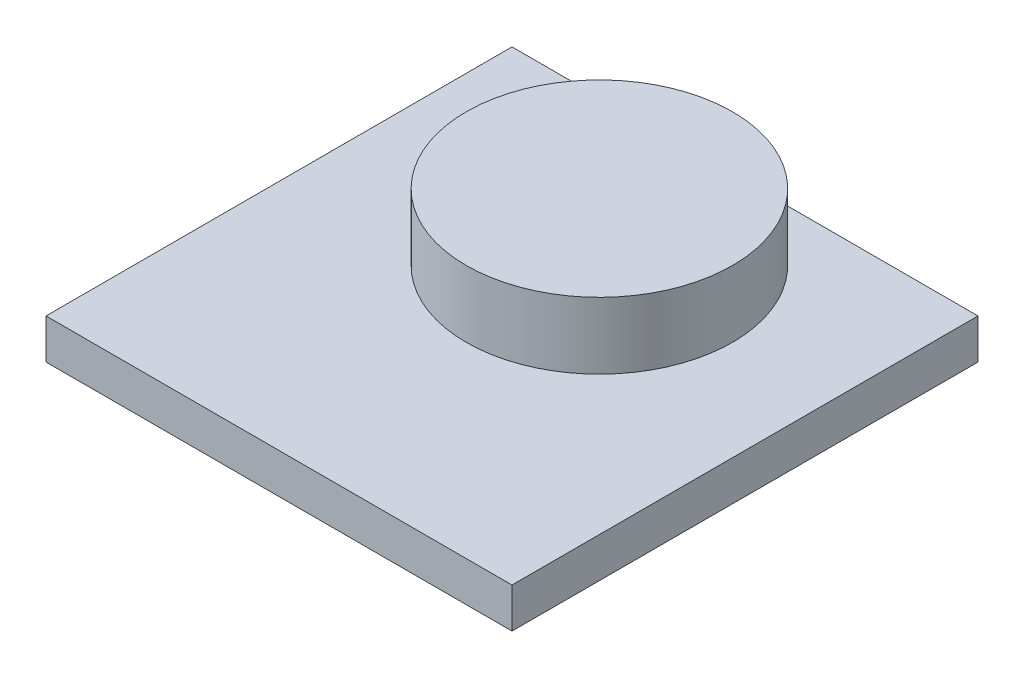
ISO-10303-21;
HEADER;
FILE_DESCRIPTION(('STEP AP214'),'2;1');
FILE_NAME('part.step','',(''),(''),'','','');
FILE_SCHEMA(('AUTOMOTIVE_DESIGN { 1 0 10303 214 1 1 1 1 }'));
ENDSEC;
DATA;
#1=APPLICATION_CONTEXT('core data for automotive mechanical design processes');
#2=APPLICATION_PROTOCOL_DEFINITION('international standard','automotive_design',2000,#1);
#3=PRODUCT_CONTEXT('',#1,'mechanical');
#4=PRODUCT('Part','Part','',(#3));
#5=PRODUCT_RELATED_PRODUCT_CATEGORY('part','',(#4));
#6=PRODUCT_DEFINITION_FORMATION('','',#4);
#7=PRODUCT_DEFINITION_CONTEXT('part definition',#1,'design');
#8=PRODUCT_DEFINITION('design','',#6,#7);
#9=PRODUCT_DEFINITION_SHAPE('','',#8);
#10=(LENGTH_UNIT() NAMED_UNIT(*) SI_UNIT(.MILLI.,.METRE.));
#11=(NAMED_UNIT(*) PLANE_ANGLE_UNIT() SI_UNIT($,.RADIAN.));
#12=(NAMED_UNIT(*) SI_UNIT($,.STERADIAN.) SOLID_ANGLE_UNIT());
#13=UNCERTAINTY_MEASURE_WITH_UNIT(LENGTH_MEASURE(1.E-05),#10,'distance_accuracy_value','');
#14=(GEOMETRIC_REPRESENTATION_CONTEXT(3) GLOBAL_UNCERTAINTY_ASSIGNED_CONTEXT((#13)) GLOBAL_UNIT_ASSIGNED_CONTEXT((#10,
#11,#12)) REPRESENTATION_CONTEXT('',''));
#15=CARTESIAN_POINT('',(0.,0.,0.));
#16=DIRECTION('',(0.,0.,1.));
#17=DIRECTION('',(1.,0.,0.));
#18=AXIS2_PLACEMENT_3D('',#15,#16,#17);
#19=CARTESIAN_POINT('',(0.,-3.,35.));
#20=DIRECTION('',(0.,0.,1.));
#21=DIRECTION('',(1.,0.,0.));
#22=AXIS2_PLACEMENT_3D('',#19,#20,#21);
#23=PLANE('',#22);
#24=DIRECTION('',(1.,0.,0.));
#25=VECTOR('',#24,1.);
#26=CARTESIAN_POINT('',(0.,0.,35.));
#27=LINE('',#26,#25);
#28=CARTESIAN_POINT('',(0.,0.,35.));
#29=VERTEX_POINT('',#28);
#30=CARTESIAN_POINT('',(35.,0.,35.));
#31=VERTEX_POINT('',#30);
#32=EDGE_CURVE('E113',#29,#31,#27,.T.);
#33=ORIENTED_EDGE('',*,*,#32,.F.);
#34=DIRECTION('',(0.,1.,0.));
#35=VECTOR('',#34,1.);
#36=CARTESIAN_POINT('',(0.,-3.,35.));
#37=LINE('',#36,#35);
#38=CARTESIAN_POINT('',(0.,-3.,35.));
#39=VERTEX_POINT('',#38);
#40=EDGE_CURVE('E51',#39,#29,#37,.T.);
#41=ORIENTED_EDGE('',*,*,#40,.F.);
#42=DIRECTION('',(1.,0.,0.));
#43=VECTOR('',#42,1.);
#44=CARTESIAN_POINT('',(0.,-3.,35.));
#45=LINE('',#44,#43);
#46=CARTESIAN_POINT('',(35.,-3.,35.));
#47=VERTEX_POINT('',#46);
#48=EDGE_CURVE('E105',#39,#47,#45,.T.);
#49=ORIENTED_EDGE('',*,*,#48,.T.);
#50=DIRECTION('',(0.,1.,0.));
#51=VECTOR('',#50,1.);
#52=CARTESIAN_POINT('',(35.,-3.,35.));
#53=LINE('',#52,#51);
#54=EDGE_CURVE('E44',#47,#31,#53,.T.);
#55=ORIENTED_EDGE('',*,*,#54,.T.);
#56=EDGE_LOOP('',(#33,#41,#49,#55));
#57=FACE_BOUND('',#56,.T.);
#58=ADVANCED_FACE('F41',(#57),#23,.T.);
#59=CARTESIAN_POINT('',(0.,-3.,0.));
#60=DIRECTION('',(-1.,0.,0.));
#61=DIRECTION('',(0.,0.,1.));
#62=AXIS2_PLACEMENT_3D('',#59,#60,#61);
#63=PLANE('',#62);
#64=DIRECTION('',(0.,0.,1.));
#65=VECTOR('',#64,1.);
#66=CARTESIAN_POINT('',(0.,0.,0.));
#67=LINE('',#66,#65);
#68=CARTESIAN_POINT('',(0.,0.,0.));
#69=VERTEX_POINT('',#68);
#70=EDGE_CURVE('E108',#69,#29,#67,.T.);
#71=ORIENTED_EDGE('',*,*,#70,.F.);
#72=DIRECTION('',(0.,1.,0.));
#73=VECTOR('',#72,1.);
#74=CARTESIAN_POINT('',(0.,-3.,0.));
#75=LINE('',#74,#73);
#76=CARTESIAN_POINT('',(0.,-3.,0.));
#77=VERTEX_POINT('',#76);
#78=EDGE_CURVE('E75',#77,#69,#75,.T.);
#79=ORIENTED_EDGE('',*,*,#78,.F.);
#80=DIRECTION('',(0.,0.,1.));
#81=VECTOR('',#80,1.);
#82=CARTESIAN_POINT('',(0.,-3.,0.));
#83=LINE('',#82,#81);
#84=EDGE_CURVE('E92',#77,#39,#83,.T.);
#85=ORIENTED_EDGE('',*,*,#84,.T.);
#86=ORIENTED_EDGE('',*,*,#40,.T.);
#87=EDGE_LOOP('',(#71,#79,#85,#86));
#88=FACE_BOUND('',#87,.T.);
#89=ADVANCED_FACE('F132',(#88),#63,.T.);
#90=CARTESIAN_POINT('',(0.,-3.,0.));
#91=DIRECTION('',(0.,0.,1.));
#92=DIRECTION('',(1.,0.,0.));
#93=AXIS2_PLACEMENT_3D('',#90,#91,#92);
#94=PLANE('',#93);
#95=DIRECTION('',(1.,0.,0.));
#96=VECTOR('',#95,1.);
#97=CARTESIAN_POINT('',(0.,0.,0.));
#98=LINE('',#97,#96);
#99=CARTESIAN_POINT('',(35.,0.,0.));
#100=VERTEX_POINT('',#99);
#101=EDGE_CURVE('E98',#69,#100,#98,.T.);
#102=ORIENTED_EDGE('',*,*,#101,.T.);
#103=DIRECTION('',(0.,1.,0.));
#104=VECTOR('',#103,1.);
#105=CARTESIAN_POINT('',(35.,-3.,0.));
#106=LINE('',#105,#104);
#107=CARTESIAN_POINT('',(35.,-3.,0.));
#108=VERTEX_POINT('',#107);
#109=EDGE_CURVE('E96',#108,#100,#106,.T.);
#110=ORIENTED_EDGE('',*,*,#109,.F.);
#111=DIRECTION('',(1.,0.,0.));
#112=VECTOR('',#111,1.);
#113=CARTESIAN_POINT('',(0.,-3.,0.));
#114=LINE('',#113,#112);
#115=EDGE_CURVE('E89',#77,#108,#114,.T.);
#116=ORIENTED_EDGE('',*,*,#115,.F.);
#117=ORIENTED_EDGE('',*,*,#78,.T.);
#118=EDGE_LOOP('',(#102,#110,#116,#117));
#119=FACE_BOUND('',#118,.T.);
#120=ADVANCED_FACE('F97',(#119),#94,.F.);
#121=CARTESIAN_POINT('',(35.,-3.,0.));
#122=DIRECTION('',(-1.,0.,0.));
#123=DIRECTION('',(0.,0.,1.));
#124=AXIS2_PLACEMENT_3D('',#121,#122,#123);
#125=PLANE('',#124);
#126=DIRECTION('',(0.,0.,1.));
#127=VECTOR('',#126,1.);
#128=CARTESIAN_POINT('',(35.,0.,0.));
#129=LINE('',#128,#127);
#130=EDGE_CURVE('E117',#100,#31,#129,.T.);
#131=ORIENTED_EDGE('',*,*,#130,.T.);
#132=ORIENTED_EDGE('',*,*,#54,.F.);
#133=DIRECTION('',(0.,0.,1.));
#134=VECTOR('',#133,1.);
#135=CARTESIAN_POINT('',(35.,-3.,0.));
#136=LINE('',#135,#134);
#137=EDGE_CURVE('E86',#108,#47,#136,.T.);
#138=ORIENTED_EDGE('',*,*,#137,.F.);
#139=ORIENTED_EDGE('',*,*,#109,.T.);
#140=EDGE_LOOP('',(#131,#132,#138,#139));
#141=FACE_BOUND('',#140,.T.);
#142=ADVANCED_FACE('F103',(#141),#125,.F.);
#143=CARTESIAN_POINT('',(0.,-3.,0.));
#144=DIRECTION('',(0.,-1.,0.));
#145=DIRECTION('',(0.,0.,-1.));
#146=AXIS2_PLACEMENT_3D('',#143,#144,#145);
#147=PLANE('',#146);
#148=ORIENTED_EDGE('',*,*,#48,.F.);
#149=ORIENTED_EDGE('',*,*,#84,.F.);
#150=ORIENTED_EDGE('',*,*,#115,.T.);
#151=ORIENTED_EDGE('',*,*,#137,.T.);
#152=EDGE_LOOP('',(#148,#149,#150,#151));
#153=FACE_BOUND('',#152,.T.);
#154=ADVANCED_FACE('F91',(#153),#147,.T.);
#155=CARTESIAN_POINT('',(0.,0.,0.));
#156=DIRECTION('',(0.,-1.,0.));
#157=DIRECTION('',(0.,0.,-1.));
#158=AXIS2_PLACEMENT_3D('',#155,#156,#157);
#159=PLANE('',#158);
#160=CARTESIAN_POINT('',(17.5,0.,10.9375));
#161=DIRECTION('',(0.,1.,0.));
#162=DIRECTION('',(0.,0.,1.));
#163=AXIS2_PLACEMENT_3D('',#160,#161,#162);
#164=CIRCLE('',#163,10.);
#165=CARTESIAN_POINT('',(17.5,0.,20.9375));
#166=VERTEX_POINT('',#165);
#167=EDGE_CURVE('E11',#166,#166,#164,.T.);
#168=ORIENTED_EDGE('',*,*,#167,.F.);
#169=EDGE_LOOP('',(#168));
#170=FACE_BOUND('',#169,.T.);
#171=ORIENTED_EDGE('',*,*,#32,.T.);
#172=ORIENTED_EDGE('',*,*,#130,.F.);
#173=ORIENTED_EDGE('',*,*,#101,.F.);
#174=ORIENTED_EDGE('',*,*,#70,.T.);
#175=EDGE_LOOP('',(#171,#172,#173,#174));
#176=FACE_BOUND('',#175,.T.);
#177=ADVANCED_FACE('F131',(#170,#176),#159,.F.);
#178=CARTESIAN_POINT('',(17.5,5.,10.9375));
#179=DIRECTION('',(0.,-1.,0.));
#180=DIRECTION('',(0.,0.,-1.));
#181=AXIS2_PLACEMENT_3D('',#178,#179,#180);
#182=CYLINDRICAL_SURFACE('',#181,10.);
#183=CARTESIAN_POINT('',(17.5,5.,10.9375));
#184=DIRECTION('',(0.,1.,0.));
#185=DIRECTION('',(0.,0.,1.));
#186=AXIS2_PLACEMENT_3D('',#183,#184,#185);
#187=CIRCLE('',#186,10.);
#188=CARTESIAN_POINT('',(17.5,5.,20.9375));
#189=VERTEX_POINT('',#188);
#190=EDGE_CURVE('E118',#189,#189,#187,.T.);
#191=ORIENTED_EDGE('',*,*,#190,.F.);
#192=EDGE_LOOP('',(#191));
#193=FACE_BOUND('',#192,.T.);
#194=ORIENTED_EDGE('',*,*,#167,.T.);
#195=EDGE_LOOP('',(#194));
#196=FACE_BOUND('',#195,.T.);
#197=ADVANCED_FACE('F149',(#193,#196),#182,.T.);
#198=CARTESIAN_POINT('',(17.5,5.,10.9375));
#199=DIRECTION('',(0.,1.,0.));
#200=DIRECTION('',(0.,0.,1.));
#201=AXIS2_PLACEMENT_3D('',#198,#199,#200);
#202=PLANE('',#201);
#203=ORIENTED_EDGE('',*,*,#190,.T.);
#204=EDGE_LOOP('',(#203));
#205=FACE_BOUND('',#204,.T.);
#206=ADVANCED_FACE('F154',(#205),#202,.T.);
#207=CLOSED_SHELL('',(#58,#89,#120,#142,#154,#177,#197,#206));
#208=MANIFOLD_SOLID_BREP('B2',#207);
#209=ADVANCED_BREP_SHAPE_REPRESENTATION('',(#18,#208),#14);
#210=SHAPE_DEFINITION_REPRESENTATION(#9,#209);
ENDSEC;
END-ISO-10303-21;
